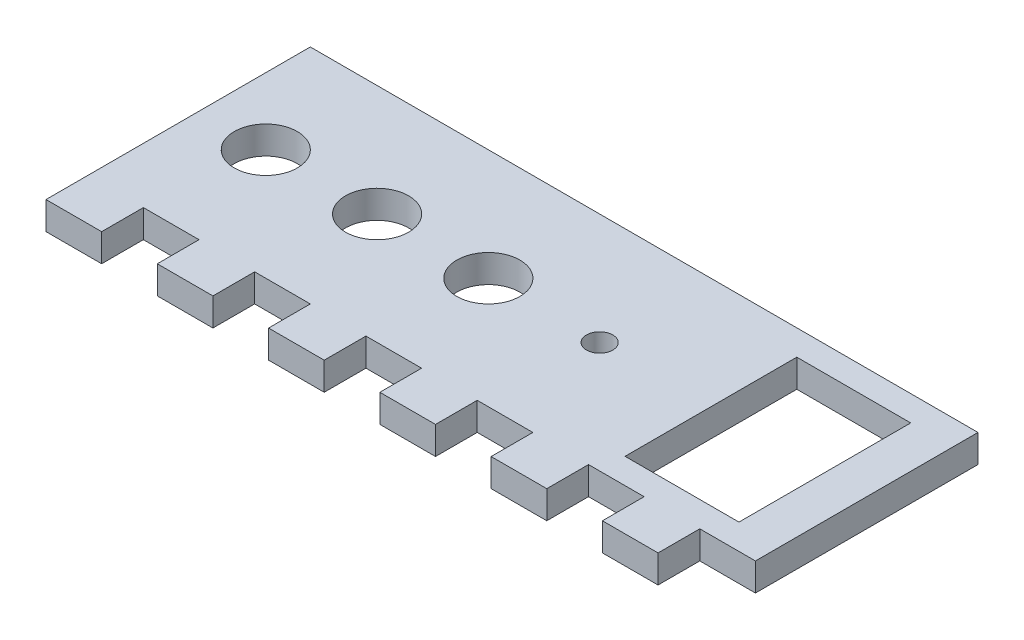
ISO-10303-21;
HEADER;
FILE_DESCRIPTION(('STEP AP214'),'2;1');
FILE_NAME('part.step','',(''),(''),'','','');
FILE_SCHEMA(('AUTOMOTIVE_DESIGN { 1 0 10303 214 1 1 1 1 }'));
ENDSEC;
DATA;
#1=APPLICATION_CONTEXT('core data for automotive mechanical design processes');
#2=APPLICATION_PROTOCOL_DEFINITION('international standard','automotive_design',2000,#1);
#3=PRODUCT_CONTEXT('',#1,'mechanical');
#4=PRODUCT('Part','Part','',(#3));
#5=PRODUCT_RELATED_PRODUCT_CATEGORY('part','',(#4));
#6=PRODUCT_DEFINITION_FORMATION('','',#4);
#7=PRODUCT_DEFINITION_CONTEXT('part definition',#1,'design');
#8=PRODUCT_DEFINITION('design','',#6,#7);
#9=PRODUCT_DEFINITION_SHAPE('','',#8);
#10=(LENGTH_UNIT() NAMED_UNIT(*) SI_UNIT(.MILLI.,.METRE.));
#11=(NAMED_UNIT(*) PLANE_ANGLE_UNIT() SI_UNIT($,.RADIAN.));
#12=(NAMED_UNIT(*) SI_UNIT($,.STERADIAN.) SOLID_ANGLE_UNIT());
#13=UNCERTAINTY_MEASURE_WITH_UNIT(LENGTH_MEASURE(1.E-05),#10,'distance_accuracy_value','');
#14=(GEOMETRIC_REPRESENTATION_CONTEXT(3) GLOBAL_UNCERTAINTY_ASSIGNED_CONTEXT((#13)) GLOBAL_UNIT_ASSIGNED_CONTEXT((#10,
#11,#12)) REPRESENTATION_CONTEXT('',''));
#15=CARTESIAN_POINT('',(0.,0.,0.));
#16=DIRECTION('',(0.,0.,1.));
#17=DIRECTION('',(1.,0.,0.));
#18=AXIS2_PLACEMENT_3D('',#15,#16,#17);
#19=CARTESIAN_POINT('',(0.,3.175,0.));
#20=DIRECTION('',(0.,-1.,0.));
#21=DIRECTION('',(0.,0.,-1.));
#22=AXIS2_PLACEMENT_3D('',#19,#20,#21);
#23=PLANE('',#22);
#24=CARTESIAN_POINT('',(7.62,3.175,-12.7));
#25=DIRECTION('',(0.,1.,0.));
#26=DIRECTION('',(0.,0.,1.));
#27=AXIS2_PLACEMENT_3D('',#24,#25,#26);
#28=CIRCLE('',#27,3.6);
#29=CARTESIAN_POINT('',(7.62,3.175,-9.1));
#30=VERTEX_POINT('',#29);
#31=EDGE_CURVE('E901',#30,#30,#28,.T.);
#32=ORIENTED_EDGE('',*,*,#31,.F.);
#33=EDGE_LOOP('',(#32));
#34=FACE_BOUND('',#33,.T.);
#35=CARTESIAN_POINT('',(45.72,3.175,-12.7));
#36=DIRECTION('',(0.,1.,0.));
#37=DIRECTION('',(0.,0.,1.));
#38=AXIS2_PLACEMENT_3D('',#35,#36,#37);
#39=CIRCLE('',#38,1.5);
#40=CARTESIAN_POINT('',(45.72,3.175,-11.2));
#41=VERTEX_POINT('',#40);
#42=EDGE_CURVE('E910',#41,#41,#39,.T.);
#43=ORIENTED_EDGE('',*,*,#42,.F.);
#44=EDGE_LOOP('',(#43));
#45=FACE_BOUND('',#44,.T.);
#46=CARTESIAN_POINT('',(33.02,3.175,-12.7));
#47=DIRECTION('',(0.,1.,0.));
#48=DIRECTION('',(0.,0.,1.));
#49=AXIS2_PLACEMENT_3D('',#46,#47,#48);
#50=CIRCLE('',#49,3.6);
#51=CARTESIAN_POINT('',(33.02,3.175,-9.1));
#52=VERTEX_POINT('',#51);
#53=EDGE_CURVE('E916',#52,#52,#50,.T.);
#54=ORIENTED_EDGE('',*,*,#53,.F.);
#55=EDGE_LOOP('',(#54));
#56=FACE_BOUND('',#55,.T.);
#57=CARTESIAN_POINT('',(20.32,3.175,-12.7));
#58=DIRECTION('',(0.,1.,0.));
#59=DIRECTION('',(0.,0.,1.));
#60=AXIS2_PLACEMENT_3D('',#57,#58,#59);
#61=CIRCLE('',#60,3.6);
#62=CARTESIAN_POINT('',(20.32,3.175,-9.1));
#63=VERTEX_POINT('',#62);
#64=EDGE_CURVE('E285',#63,#63,#61,.T.);
#65=ORIENTED_EDGE('',*,*,#64,.F.);
#66=EDGE_LOOP('',(#65));
#67=FACE_BOUND('',#66,.T.);
#68=DIRECTION('',(0.,0.,1.));
#69=VECTOR('',#68,1.);
#70=CARTESIAN_POINT('',(0.,3.175,0.));
#71=LINE('',#70,#69);
#72=CARTESIAN_POINT('',(0.,3.175,-25.4));
#73=VERTEX_POINT('',#72);
#74=CARTESIAN_POINT('',(0.,3.175,4.7625));
#75=VERTEX_POINT('',#74);
#76=EDGE_CURVE('E336',#73,#75,#71,.T.);
#77=ORIENTED_EDGE('',*,*,#76,.T.);
#78=DIRECTION('',(1.,0.,0.));
#79=VECTOR('',#78,1.);
#80=CARTESIAN_POINT('',(0.,3.175,4.7625));
#81=LINE('',#80,#79);
#82=CARTESIAN_POINT('',(6.35,3.175,4.7625));
#83=VERTEX_POINT('',#82);
#84=EDGE_CURVE('E533',#75,#83,#81,.T.);
#85=ORIENTED_EDGE('',*,*,#84,.T.);
#86=DIRECTION('',(0.,0.,-1.));
#87=VECTOR('',#86,1.);
#88=CARTESIAN_POINT('',(6.35,3.175,4.7625));
#89=LINE('',#88,#87);
#90=CARTESIAN_POINT('',(6.35,3.175,0.));
#91=VERTEX_POINT('',#90);
#92=EDGE_CURVE('E414',#83,#91,#89,.T.);
#93=ORIENTED_EDGE('',*,*,#92,.T.);
#94=DIRECTION('',(1.,0.,0.));
#95=VECTOR('',#94,1.);
#96=CARTESIAN_POINT('',(6.35,3.175,0.));
#97=LINE('',#96,#95);
#98=CARTESIAN_POINT('',(12.7,3.175,0.));
#99=VERTEX_POINT('',#98);
#100=EDGE_CURVE('E436',#91,#99,#97,.T.);
#101=ORIENTED_EDGE('',*,*,#100,.T.);
#102=DIRECTION('',(0.,0.,1.));
#103=VECTOR('',#102,1.);
#104=CARTESIAN_POINT('',(12.7,3.175,0.));
#105=LINE('',#104,#103);
#106=CARTESIAN_POINT('',(12.7,3.175,4.7625));
#107=VERTEX_POINT('',#106);
#108=EDGE_CURVE('E432',#99,#107,#105,.T.);
#109=ORIENTED_EDGE('',*,*,#108,.T.);
#110=DIRECTION('',(1.,0.,0.));
#111=VECTOR('',#110,1.);
#112=CARTESIAN_POINT('',(12.7,3.175,4.7625));
#113=LINE('',#112,#111);
#114=CARTESIAN_POINT('',(19.05,3.175,4.7625));
#115=VERTEX_POINT('',#114);
#116=EDGE_CURVE('E435',#107,#115,#113,.T.);
#117=ORIENTED_EDGE('',*,*,#116,.T.);
#118=DIRECTION('',(0.,0.,-1.));
#119=VECTOR('',#118,1.);
#120=CARTESIAN_POINT('',(19.05,3.175,4.7625));
#121=LINE('',#120,#119);
#122=CARTESIAN_POINT('',(19.05,3.175,0.));
#123=VERTEX_POINT('',#122);
#124=EDGE_CURVE('E438',#115,#123,#121,.T.);
#125=ORIENTED_EDGE('',*,*,#124,.T.);
#126=DIRECTION('',(1.,0.,0.));
#127=VECTOR('',#126,1.);
#128=CARTESIAN_POINT('',(19.05,3.175,0.));
#129=LINE('',#128,#127);
#130=CARTESIAN_POINT('',(25.4,3.175,0.));
#131=VERTEX_POINT('',#130);
#132=EDGE_CURVE('E455',#123,#131,#129,.T.);
#133=ORIENTED_EDGE('',*,*,#132,.T.);
#134=DIRECTION('',(0.,0.,1.));
#135=VECTOR('',#134,1.);
#136=CARTESIAN_POINT('',(25.4,3.175,0.));
#137=LINE('',#136,#135);
#138=CARTESIAN_POINT('',(25.4,3.175,4.7625));
#139=VERTEX_POINT('',#138);
#140=EDGE_CURVE('E458',#131,#139,#137,.T.);
#141=ORIENTED_EDGE('',*,*,#140,.T.);
#142=DIRECTION('',(1.,0.,0.));
#143=VECTOR('',#142,1.);
#144=CARTESIAN_POINT('',(25.4,3.175,4.7625));
#145=LINE('',#144,#143);
#146=CARTESIAN_POINT('',(31.75,3.175,4.7625));
#147=VERTEX_POINT('',#146);
#148=EDGE_CURVE('E461',#139,#147,#145,.T.);
#149=ORIENTED_EDGE('',*,*,#148,.T.);
#150=DIRECTION('',(0.,0.,-1.));
#151=VECTOR('',#150,1.);
#152=CARTESIAN_POINT('',(31.75,3.175,4.7625));
#153=LINE('',#152,#151);
#154=CARTESIAN_POINT('',(31.75,3.175,0.));
#155=VERTEX_POINT('',#154);
#156=EDGE_CURVE('E469',#147,#155,#153,.T.);
#157=ORIENTED_EDGE('',*,*,#156,.T.);
#158=DIRECTION('',(1.,0.,0.));
#159=VECTOR('',#158,1.);
#160=CARTESIAN_POINT('',(31.75,3.175,0.));
#161=LINE('',#160,#159);
#162=CARTESIAN_POINT('',(38.1,3.175,0.));
#163=VERTEX_POINT('',#162);
#164=EDGE_CURVE('E471',#155,#163,#161,.T.);
#165=ORIENTED_EDGE('',*,*,#164,.T.);
#166=DIRECTION('',(0.,0.,1.));
#167=VECTOR('',#166,1.);
#168=CARTESIAN_POINT('',(38.1,3.175,0.));
#169=LINE('',#168,#167);
#170=CARTESIAN_POINT('',(38.1,3.175,4.7625));
#171=VERTEX_POINT('',#170);
#172=EDGE_CURVE('E474',#163,#171,#169,.T.);
#173=ORIENTED_EDGE('',*,*,#172,.T.);
#174=DIRECTION('',(1.,0.,0.));
#175=VECTOR('',#174,1.);
#176=CARTESIAN_POINT('',(38.1,3.175,4.7625));
#177=LINE('',#176,#175);
#178=CARTESIAN_POINT('',(44.45,3.175,4.7625));
#179=VERTEX_POINT('',#178);
#180=EDGE_CURVE('E477',#171,#179,#177,.T.);
#181=ORIENTED_EDGE('',*,*,#180,.T.);
#182=DIRECTION('',(0.,0.,-1.));
#183=VECTOR('',#182,1.);
#184=CARTESIAN_POINT('',(44.45,3.175,4.7625));
#185=LINE('',#184,#183);
#186=CARTESIAN_POINT('',(44.45,3.175,0.));
#187=VERTEX_POINT('',#186);
#188=EDGE_CURVE('E485',#179,#187,#185,.T.);
#189=ORIENTED_EDGE('',*,*,#188,.T.);
#190=DIRECTION('',(1.,0.,0.));
#191=VECTOR('',#190,1.);
#192=CARTESIAN_POINT('',(44.45,3.175,0.));
#193=LINE('',#192,#191);
#194=CARTESIAN_POINT('',(50.8,3.175,0.));
#195=VERTEX_POINT('',#194);
#196=EDGE_CURVE('E487',#187,#195,#193,.T.);
#197=ORIENTED_EDGE('',*,*,#196,.T.);
#198=DIRECTION('',(0.,0.,1.));
#199=VECTOR('',#198,1.);
#200=CARTESIAN_POINT('',(50.8,3.175,0.));
#201=LINE('',#200,#199);
#202=CARTESIAN_POINT('',(50.8,3.175,4.7625));
#203=VERTEX_POINT('',#202);
#204=EDGE_CURVE('E490',#195,#203,#201,.T.);
#205=ORIENTED_EDGE('',*,*,#204,.T.);
#206=DIRECTION('',(1.,0.,0.));
#207=VECTOR('',#206,1.);
#208=CARTESIAN_POINT('',(50.8,3.175,4.7625));
#209=LINE('',#208,#207);
#210=CARTESIAN_POINT('',(57.15,3.175,4.7625));
#211=VERTEX_POINT('',#210);
#212=EDGE_CURVE('E493',#203,#211,#209,.T.);
#213=ORIENTED_EDGE('',*,*,#212,.T.);
#214=DIRECTION('',(0.,0.,-1.));
#215=VECTOR('',#214,1.);
#216=CARTESIAN_POINT('',(57.15,3.175,4.7625));
#217=LINE('',#216,#215);
#218=CARTESIAN_POINT('',(57.15,3.175,0.));
#219=VERTEX_POINT('',#218);
#220=EDGE_CURVE('E501',#211,#219,#217,.T.);
#221=ORIENTED_EDGE('',*,*,#220,.T.);
#222=DIRECTION('',(1.,0.,0.));
#223=VECTOR('',#222,1.);
#224=CARTESIAN_POINT('',(57.15,3.175,0.));
#225=LINE('',#224,#223);
#226=CARTESIAN_POINT('',(63.5,3.175,0.));
#227=VERTEX_POINT('',#226);
#228=EDGE_CURVE('E503',#219,#227,#225,.T.);
#229=ORIENTED_EDGE('',*,*,#228,.T.);
#230=DIRECTION('',(0.,0.,1.));
#231=VECTOR('',#230,1.);
#232=CARTESIAN_POINT('',(63.5,3.175,0.));
#233=LINE('',#232,#231);
#234=CARTESIAN_POINT('',(63.5,3.175,4.7625));
#235=VERTEX_POINT('',#234);
#236=EDGE_CURVE('E506',#227,#235,#233,.T.);
#237=ORIENTED_EDGE('',*,*,#236,.T.);
#238=DIRECTION('',(1.,0.,0.));
#239=VECTOR('',#238,1.);
#240=CARTESIAN_POINT('',(63.5,3.175,4.7625));
#241=LINE('',#240,#239);
#242=CARTESIAN_POINT('',(69.85,3.175,4.7625));
#243=VERTEX_POINT('',#242);
#244=EDGE_CURVE('E509',#235,#243,#241,.T.);
#245=ORIENTED_EDGE('',*,*,#244,.T.);
#246=DIRECTION('',(0.,0.,-1.));
#247=VECTOR('',#246,1.);
#248=CARTESIAN_POINT('',(69.85,3.175,4.7625));
#249=LINE('',#248,#247);
#250=CARTESIAN_POINT('',(69.85,3.175,0.));
#251=VERTEX_POINT('',#250);
#252=EDGE_CURVE('E514',#243,#251,#249,.T.);
#253=ORIENTED_EDGE('',*,*,#252,.T.);
#254=DIRECTION('',(1.,0.,0.));
#255=VECTOR('',#254,1.);
#256=CARTESIAN_POINT('',(69.85,3.175,0.));
#257=LINE('',#256,#255);
#258=CARTESIAN_POINT('',(76.2,3.175,0.));
#259=VERTEX_POINT('',#258);
#260=EDGE_CURVE('E516',#251,#259,#257,.T.);
#261=ORIENTED_EDGE('',*,*,#260,.T.);
#262=DIRECTION('',(0.,0.,-1.));
#263=VECTOR('',#262,1.);
#264=CARTESIAN_POINT('',(76.2,3.175,0.));
#265=LINE('',#264,#263);
#266=CARTESIAN_POINT('',(76.2,3.175,-25.4));
#267=VERTEX_POINT('',#266);
#268=EDGE_CURVE('E279',#259,#267,#265,.T.);
#269=ORIENTED_EDGE('',*,*,#268,.T.);
#270=DIRECTION('',(-1.,0.,0.));
#271=VECTOR('',#270,1.);
#272=CARTESIAN_POINT('',(0.,3.175,-25.4));
#273=LINE('',#272,#271);
#274=EDGE_CURVE('E275',#267,#73,#273,.T.);
#275=ORIENTED_EDGE('',*,*,#274,.T.);
#276=EDGE_LOOP('',(#77,#85,#93,#101,#109,#117,#125,#133,#141,#149,#157,#165,#173,#181,#189,#197,
#205,#213,#221,#229,#237,#245,#253,#261,#269,#275));
#277=FACE_BOUND('',#276,.T.);
#278=DIRECTION('',(0.,0.,1.));
#279=VECTOR('',#278,1.);
#280=CARTESIAN_POINT('',(58.42,3.175,-22.5));
#281=LINE('',#280,#279);
#282=CARTESIAN_POINT('',(58.42,3.175,-22.5));
#283=VERTEX_POINT('',#282);
#284=CARTESIAN_POINT('',(58.42,3.175,-2.9));
#285=VERTEX_POINT('',#284);
#286=EDGE_CURVE('E239',#283,#285,#281,.T.);
#287=ORIENTED_EDGE('',*,*,#286,.F.);
#288=DIRECTION('',(-1.,0.,0.));
#289=VECTOR('',#288,1.);
#290=CARTESIAN_POINT('',(58.42,3.175,-22.5));
#291=LINE('',#290,#289);
#292=CARTESIAN_POINT('',(71.42,3.175,-22.5));
#293=VERTEX_POINT('',#292);
#294=EDGE_CURVE('E260',#293,#283,#291,.T.);
#295=ORIENTED_EDGE('',*,*,#294,.F.);
#296=DIRECTION('',(0.,0.,-1.));
#297=VECTOR('',#296,1.);
#298=CARTESIAN_POINT('',(71.42,3.175,-22.5));
#299=LINE('',#298,#297);
#300=CARTESIAN_POINT('',(71.42,3.175,-2.9));
#301=VERTEX_POINT('',#300);
#302=EDGE_CURVE('E259',#301,#293,#299,.T.);
#303=ORIENTED_EDGE('',*,*,#302,.F.);
#304=DIRECTION('',(1.,0.,0.));
#305=VECTOR('',#304,1.);
#306=CARTESIAN_POINT('',(58.42,3.175,-2.9));
#307=LINE('',#306,#305);
#308=EDGE_CURVE('E247',#285,#301,#307,.T.);
#309=ORIENTED_EDGE('',*,*,#308,.F.);
#310=EDGE_LOOP('',(#287,#295,#303,#309));
#311=FACE_BOUND('',#310,.T.);
#312=ADVANCED_FACE('F42',(#34,#45,#56,#67,#277,#311),#23,.F.);
#313=CARTESIAN_POINT('',(0.,0.,0.));
#314=DIRECTION('',(0.,-1.,0.));
#315=DIRECTION('',(0.,0.,-1.));
#316=AXIS2_PLACEMENT_3D('',#313,#314,#315);
#317=PLANE('',#316);
#318=CARTESIAN_POINT('',(45.72,0.,-12.7));
#319=DIRECTION('',(0.,1.,0.));
#320=DIRECTION('',(0.,0.,1.));
#321=AXIS2_PLACEMENT_3D('',#318,#319,#320);
#322=CIRCLE('',#321,1.5);
#323=CARTESIAN_POINT('',(45.72,0.,-11.2));
#324=VERTEX_POINT('',#323);
#325=EDGE_CURVE('E905',#324,#324,#322,.T.);
#326=ORIENTED_EDGE('',*,*,#325,.T.);
#327=EDGE_LOOP('',(#326));
#328=FACE_BOUND('',#327,.T.);
#329=CARTESIAN_POINT('',(20.32,0.,-12.7));
#330=DIRECTION('',(0.,1.,0.));
#331=DIRECTION('',(0.,0.,1.));
#332=AXIS2_PLACEMENT_3D('',#329,#330,#331);
#333=CIRCLE('',#332,3.6);
#334=CARTESIAN_POINT('',(20.32,0.,-9.1));
#335=VERTEX_POINT('',#334);
#336=EDGE_CURVE('E538',#335,#335,#333,.T.);
#337=ORIENTED_EDGE('',*,*,#336,.T.);
#338=EDGE_LOOP('',(#337));
#339=FACE_BOUND('',#338,.T.);
#340=DIRECTION('',(0.,0.,1.));
#341=VECTOR('',#340,1.);
#342=CARTESIAN_POINT('',(0.,0.,0.));
#343=LINE('',#342,#341);
#344=CARTESIAN_POINT('',(0.,0.,-25.4));
#345=VERTEX_POINT('',#344);
#346=CARTESIAN_POINT('',(0.,0.,4.7625));
#347=VERTEX_POINT('',#346);
#348=EDGE_CURVE('E282',#345,#347,#343,.T.);
#349=ORIENTED_EDGE('',*,*,#348,.F.);
#350=DIRECTION('',(-1.,0.,0.));
#351=VECTOR('',#350,1.);
#352=CARTESIAN_POINT('',(0.,0.,-25.4));
#353=LINE('',#352,#351);
#354=CARTESIAN_POINT('',(76.2,0.,-25.4));
#355=VERTEX_POINT('',#354);
#356=EDGE_CURVE('E333',#355,#345,#353,.T.);
#357=ORIENTED_EDGE('',*,*,#356,.F.);
#358=DIRECTION('',(0.,0.,-1.));
#359=VECTOR('',#358,1.);
#360=CARTESIAN_POINT('',(76.2,0.,0.));
#361=LINE('',#360,#359);
#362=CARTESIAN_POINT('',(76.2,0.,0.));
#363=VERTEX_POINT('',#362);
#364=EDGE_CURVE('E331',#363,#355,#361,.T.);
#365=ORIENTED_EDGE('',*,*,#364,.F.);
#366=DIRECTION('',(1.,0.,0.));
#367=VECTOR('',#366,1.);
#368=CARTESIAN_POINT('',(69.85,0.,0.));
#369=LINE('',#368,#367);
#370=CARTESIAN_POINT('',(69.85,0.,0.));
#371=VERTEX_POINT('',#370);
#372=EDGE_CURVE('E329',#371,#363,#369,.T.);
#373=ORIENTED_EDGE('',*,*,#372,.F.);
#374=DIRECTION('',(0.,0.,-1.));
#375=VECTOR('',#374,1.);
#376=CARTESIAN_POINT('',(69.85,0.,4.7625));
#377=LINE('',#376,#375);
#378=CARTESIAN_POINT('',(69.85,0.,4.7625));
#379=VERTEX_POINT('',#378);
#380=EDGE_CURVE('E327',#379,#371,#377,.T.);
#381=ORIENTED_EDGE('',*,*,#380,.F.);
#382=DIRECTION('',(1.,0.,0.));
#383=VECTOR('',#382,1.);
#384=CARTESIAN_POINT('',(63.5,0.,4.7625));
#385=LINE('',#384,#383);
#386=CARTESIAN_POINT('',(63.5,0.,4.7625));
#387=VERTEX_POINT('',#386);
#388=EDGE_CURVE('E325',#387,#379,#385,.T.);
#389=ORIENTED_EDGE('',*,*,#388,.F.);
#390=DIRECTION('',(0.,0.,1.));
#391=VECTOR('',#390,1.);
#392=CARTESIAN_POINT('',(63.5,0.,0.));
#393=LINE('',#392,#391);
#394=CARTESIAN_POINT('',(63.5,0.,0.));
#395=VERTEX_POINT('',#394);
#396=EDGE_CURVE('E323',#395,#387,#393,.T.);
#397=ORIENTED_EDGE('',*,*,#396,.F.);
#398=DIRECTION('',(1.,0.,0.));
#399=VECTOR('',#398,1.);
#400=CARTESIAN_POINT('',(57.15,0.,0.));
#401=LINE('',#400,#399);
#402=CARTESIAN_POINT('',(57.15,0.,0.));
#403=VERTEX_POINT('',#402);
#404=EDGE_CURVE('E321',#403,#395,#401,.T.);
#405=ORIENTED_EDGE('',*,*,#404,.F.);
#406=DIRECTION('',(0.,0.,-1.));
#407=VECTOR('',#406,1.);
#408=CARTESIAN_POINT('',(57.15,0.,4.7625));
#409=LINE('',#408,#407);
#410=CARTESIAN_POINT('',(57.15,0.,4.7625));
#411=VERTEX_POINT('',#410);
#412=EDGE_CURVE('E319',#411,#403,#409,.T.);
#413=ORIENTED_EDGE('',*,*,#412,.F.);
#414=DIRECTION('',(1.,0.,0.));
#415=VECTOR('',#414,1.);
#416=CARTESIAN_POINT('',(50.8,0.,4.7625));
#417=LINE('',#416,#415);
#418=CARTESIAN_POINT('',(50.8,0.,4.7625));
#419=VERTEX_POINT('',#418);
#420=EDGE_CURVE('E317',#419,#411,#417,.T.);
#421=ORIENTED_EDGE('',*,*,#420,.F.);
#422=DIRECTION('',(0.,0.,1.));
#423=VECTOR('',#422,1.);
#424=CARTESIAN_POINT('',(50.8,0.,0.));
#425=LINE('',#424,#423);
#426=CARTESIAN_POINT('',(50.8,0.,0.));
#427=VERTEX_POINT('',#426);
#428=EDGE_CURVE('E315',#427,#419,#425,.T.);
#429=ORIENTED_EDGE('',*,*,#428,.F.);
#430=DIRECTION('',(1.,0.,0.));
#431=VECTOR('',#430,1.);
#432=CARTESIAN_POINT('',(44.45,0.,0.));
#433=LINE('',#432,#431);
#434=CARTESIAN_POINT('',(44.45,0.,0.));
#435=VERTEX_POINT('',#434);
#436=EDGE_CURVE('E313',#435,#427,#433,.T.);
#437=ORIENTED_EDGE('',*,*,#436,.F.);
#438=DIRECTION('',(0.,0.,-1.));
#439=VECTOR('',#438,1.);
#440=CARTESIAN_POINT('',(44.45,0.,4.7625));
#441=LINE('',#440,#439);
#442=CARTESIAN_POINT('',(44.45,0.,4.7625));
#443=VERTEX_POINT('',#442);
#444=EDGE_CURVE('E311',#443,#435,#441,.T.);
#445=ORIENTED_EDGE('',*,*,#444,.F.);
#446=DIRECTION('',(1.,0.,0.));
#447=VECTOR('',#446,1.);
#448=CARTESIAN_POINT('',(38.1,0.,4.7625));
#449=LINE('',#448,#447);
#450=CARTESIAN_POINT('',(38.1,0.,4.7625));
#451=VERTEX_POINT('',#450);
#452=EDGE_CURVE('E309',#451,#443,#449,.T.);
#453=ORIENTED_EDGE('',*,*,#452,.F.);
#454=DIRECTION('',(0.,0.,1.));
#455=VECTOR('',#454,1.);
#456=CARTESIAN_POINT('',(38.1,0.,0.));
#457=LINE('',#456,#455);
#458=CARTESIAN_POINT('',(38.1,0.,0.));
#459=VERTEX_POINT('',#458);
#460=EDGE_CURVE('E307',#459,#451,#457,.T.);
#461=ORIENTED_EDGE('',*,*,#460,.F.);
#462=DIRECTION('',(1.,0.,0.));
#463=VECTOR('',#462,1.);
#464=CARTESIAN_POINT('',(31.75,0.,0.));
#465=LINE('',#464,#463);
#466=CARTESIAN_POINT('',(31.75,0.,0.));
#467=VERTEX_POINT('',#466);
#468=EDGE_CURVE('E305',#467,#459,#465,.T.);
#469=ORIENTED_EDGE('',*,*,#468,.F.);
#470=DIRECTION('',(0.,0.,-1.));
#471=VECTOR('',#470,1.);
#472=CARTESIAN_POINT('',(31.75,0.,4.7625));
#473=LINE('',#472,#471);
#474=CARTESIAN_POINT('',(31.75,0.,4.7625));
#475=VERTEX_POINT('',#474);
#476=EDGE_CURVE('E303',#475,#467,#473,.T.);
#477=ORIENTED_EDGE('',*,*,#476,.F.);
#478=DIRECTION('',(1.,0.,0.));
#479=VECTOR('',#478,1.);
#480=CARTESIAN_POINT('',(25.4,0.,4.7625));
#481=LINE('',#480,#479);
#482=CARTESIAN_POINT('',(25.4,0.,4.7625));
#483=VERTEX_POINT('',#482);
#484=EDGE_CURVE('E301',#483,#475,#481,.T.);
#485=ORIENTED_EDGE('',*,*,#484,.F.);
#486=DIRECTION('',(0.,0.,1.));
#487=VECTOR('',#486,1.);
#488=CARTESIAN_POINT('',(25.4,0.,0.));
#489=LINE('',#488,#487);
#490=CARTESIAN_POINT('',(25.4,0.,0.));
#491=VERTEX_POINT('',#490);
#492=EDGE_CURVE('E299',#491,#483,#489,.T.);
#493=ORIENTED_EDGE('',*,*,#492,.F.);
#494=DIRECTION('',(1.,0.,0.));
#495=VECTOR('',#494,1.);
#496=CARTESIAN_POINT('',(19.05,0.,0.));
#497=LINE('',#496,#495);
#498=CARTESIAN_POINT('',(19.05,0.,0.));
#499=VERTEX_POINT('',#498);
#500=EDGE_CURVE('E297',#499,#491,#497,.T.);
#501=ORIENTED_EDGE('',*,*,#500,.F.);
#502=DIRECTION('',(0.,0.,-1.));
#503=VECTOR('',#502,1.);
#504=CARTESIAN_POINT('',(19.05,0.,4.7625));
#505=LINE('',#504,#503);
#506=CARTESIAN_POINT('',(19.05,0.,4.7625));
#507=VERTEX_POINT('',#506);
#508=EDGE_CURVE('E295',#507,#499,#505,.T.);
#509=ORIENTED_EDGE('',*,*,#508,.F.);
#510=DIRECTION('',(1.,0.,0.));
#511=VECTOR('',#510,1.);
#512=CARTESIAN_POINT('',(12.7,0.,4.7625));
#513=LINE('',#512,#511);
#514=CARTESIAN_POINT('',(12.7,0.,4.7625));
#515=VERTEX_POINT('',#514);
#516=EDGE_CURVE('E293',#515,#507,#513,.T.);
#517=ORIENTED_EDGE('',*,*,#516,.F.);
#518=DIRECTION('',(0.,0.,1.));
#519=VECTOR('',#518,1.);
#520=CARTESIAN_POINT('',(12.7,0.,0.));
#521=LINE('',#520,#519);
#522=CARTESIAN_POINT('',(12.7,0.,0.));
#523=VERTEX_POINT('',#522);
#524=EDGE_CURVE('E291',#523,#515,#521,.T.);
#525=ORIENTED_EDGE('',*,*,#524,.F.);
#526=DIRECTION('',(1.,0.,0.));
#527=VECTOR('',#526,1.);
#528=CARTESIAN_POINT('',(6.35,0.,0.));
#529=LINE('',#528,#527);
#530=CARTESIAN_POINT('',(6.35,0.,0.));
#531=VERTEX_POINT('',#530);
#532=EDGE_CURVE('E289',#531,#523,#529,.T.);
#533=ORIENTED_EDGE('',*,*,#532,.F.);
#534=DIRECTION('',(0.,0.,-1.));
#535=VECTOR('',#534,1.);
#536=CARTESIAN_POINT('',(6.35,0.,4.7625));
#537=LINE('',#536,#535);
#538=CARTESIAN_POINT('',(6.35,0.,4.7625));
#539=VERTEX_POINT('',#538);
#540=EDGE_CURVE('E287',#539,#531,#537,.T.);
#541=ORIENTED_EDGE('',*,*,#540,.F.);
#542=DIRECTION('',(1.,0.,0.));
#543=VECTOR('',#542,1.);
#544=CARTESIAN_POINT('',(0.,0.,4.7625));
#545=LINE('',#544,#543);
#546=EDGE_CURVE('E284',#347,#539,#545,.T.);
#547=ORIENTED_EDGE('',*,*,#546,.F.);
#548=EDGE_LOOP('',(#349,#357,#365,#373,#381,#389,#397,#405,#413,#421,#429,#437,#445,#453,#461,
#469,#477,#485,#493,#501,#509,#517,#525,#533,#541,#547));
#549=FACE_BOUND('',#548,.T.);
#550=CARTESIAN_POINT('',(33.02,0.,-12.7));
#551=DIRECTION('',(0.,1.,0.));
#552=DIRECTION('',(0.,0.,1.));
#553=AXIS2_PLACEMENT_3D('',#550,#551,#552);
#554=CIRCLE('',#553,3.6);
#555=CARTESIAN_POINT('',(33.02,0.,-9.1));
#556=VERTEX_POINT('',#555);
#557=EDGE_CURVE('E914',#556,#556,#554,.T.);
#558=ORIENTED_EDGE('',*,*,#557,.T.);
#559=EDGE_LOOP('',(#558));
#560=FACE_BOUND('',#559,.T.);
#561=CARTESIAN_POINT('',(7.62,0.,-12.7));
#562=DIRECTION('',(0.,1.,0.));
#563=DIRECTION('',(0.,0.,1.));
#564=AXIS2_PLACEMENT_3D('',#561,#562,#563);
#565=CIRCLE('',#564,3.6);
#566=CARTESIAN_POINT('',(7.62,0.,-9.1));
#567=VERTEX_POINT('',#566);
#568=EDGE_CURVE('E255',#567,#567,#565,.T.);
#569=ORIENTED_EDGE('',*,*,#568,.T.);
#570=EDGE_LOOP('',(#569));
#571=FACE_BOUND('',#570,.T.);
#572=DIRECTION('',(-1.,0.,0.));
#573=VECTOR('',#572,1.);
#574=CARTESIAN_POINT('',(58.42,0.,-22.5));
#575=LINE('',#574,#573);
#576=CARTESIAN_POINT('',(71.42,0.,-22.5));
#577=VERTEX_POINT('',#576);
#578=CARTESIAN_POINT('',(58.42,0.,-22.5));
#579=VERTEX_POINT('',#578);
#580=EDGE_CURVE('E248',#577,#579,#575,.T.);
#581=ORIENTED_EDGE('',*,*,#580,.T.);
#582=DIRECTION('',(0.,0.,1.));
#583=VECTOR('',#582,1.);
#584=CARTESIAN_POINT('',(58.42,0.,-22.5));
#585=LINE('',#584,#583);
#586=CARTESIAN_POINT('',(58.42,0.,-2.9));
#587=VERTEX_POINT('',#586);
#588=EDGE_CURVE('E65',#579,#587,#585,.T.);
#589=ORIENTED_EDGE('',*,*,#588,.T.);
#590=DIRECTION('',(1.,0.,0.));
#591=VECTOR('',#590,1.);
#592=CARTESIAN_POINT('',(58.42,0.,-2.9));
#593=LINE('',#592,#591);
#594=CARTESIAN_POINT('',(71.42,0.,-2.9));
#595=VERTEX_POINT('',#594);
#596=EDGE_CURVE('E254',#587,#595,#593,.T.);
#597=ORIENTED_EDGE('',*,*,#596,.T.);
#598=DIRECTION('',(0.,0.,-1.));
#599=VECTOR('',#598,1.);
#600=CARTESIAN_POINT('',(71.42,0.,-22.5));
#601=LINE('',#600,#599);
#602=EDGE_CURVE('E892',#595,#577,#601,.T.);
#603=ORIENTED_EDGE('',*,*,#602,.T.);
#604=EDGE_LOOP('',(#581,#589,#597,#603));
#605=FACE_BOUND('',#604,.T.);
#606=ADVANCED_FACE('F420',(#328,#339,#549,#560,#571,#605),#317,.T.);
#607=CARTESIAN_POINT('',(0.,3.175,0.));
#608=DIRECTION('',(1.,0.,0.));
#609=DIRECTION('',(0.,0.,-1.));
#610=AXIS2_PLACEMENT_3D('',#607,#608,#609);
#611=PLANE('',#610);
#612=ORIENTED_EDGE('',*,*,#348,.T.);
#613=DIRECTION('',(0.,-1.,0.));
#614=VECTOR('',#613,1.);
#615=CARTESIAN_POINT('',(0.,3.175,4.7625));
#616=LINE('',#615,#614);
#617=EDGE_CURVE('E12',#75,#347,#616,.T.);
#618=ORIENTED_EDGE('',*,*,#617,.F.);
#619=ORIENTED_EDGE('',*,*,#76,.F.);
#620=DIRECTION('',(0.,-1.,0.));
#621=VECTOR('',#620,1.);
#622=CARTESIAN_POINT('',(0.,3.175,-25.4));
#623=LINE('',#622,#621);
#624=EDGE_CURVE('E278',#73,#345,#623,.T.);
#625=ORIENTED_EDGE('',*,*,#624,.T.);
#626=EDGE_LOOP('',(#612,#618,#619,#625));
#627=FACE_BOUND('',#626,.T.);
#628=ADVANCED_FACE('F44',(#627),#611,.F.);
#629=CARTESIAN_POINT('',(0.,3.175,4.7625));
#630=DIRECTION('',(0.,0.,-1.));
#631=DIRECTION('',(-1.,0.,0.));
#632=AXIS2_PLACEMENT_3D('',#629,#630,#631);
#633=PLANE('',#632);
#634=ORIENTED_EDGE('',*,*,#546,.T.);
#635=DIRECTION('',(0.,-1.,0.));
#636=VECTOR('',#635,1.);
#637=CARTESIAN_POINT('',(6.35,3.175,4.7625));
#638=LINE('',#637,#636);
#639=EDGE_CURVE('E50',#83,#539,#638,.T.);
#640=ORIENTED_EDGE('',*,*,#639,.F.);
#641=ORIENTED_EDGE('',*,*,#84,.F.);
#642=ORIENTED_EDGE('',*,*,#617,.T.);
#643=EDGE_LOOP('',(#634,#640,#641,#642));
#644=FACE_BOUND('',#643,.T.);
#645=ADVANCED_FACE('F546',(#644),#633,.F.);
#646=CARTESIAN_POINT('',(6.35,3.175,4.7625));
#647=DIRECTION('',(-1.,0.,0.));
#648=DIRECTION('',(0.,0.,1.));
#649=AXIS2_PLACEMENT_3D('',#646,#647,#648);
#650=PLANE('',#649);
#651=ORIENTED_EDGE('',*,*,#540,.T.);
#652=DIRECTION('',(0.,-1.,0.));
#653=VECTOR('',#652,1.);
#654=CARTESIAN_POINT('',(6.35,3.175,0.));
#655=LINE('',#654,#653);
#656=EDGE_CURVE('E405',#91,#531,#655,.T.);
#657=ORIENTED_EDGE('',*,*,#656,.F.);
#658=ORIENTED_EDGE('',*,*,#92,.F.);
#659=ORIENTED_EDGE('',*,*,#639,.T.);
#660=EDGE_LOOP('',(#651,#657,#658,#659));
#661=FACE_BOUND('',#660,.T.);
#662=ADVANCED_FACE('F412',(#661),#650,.F.);
#663=CARTESIAN_POINT('',(6.35,3.175,0.));
#664=DIRECTION('',(0.,0.,-1.));
#665=DIRECTION('',(-1.,0.,0.));
#666=AXIS2_PLACEMENT_3D('',#663,#664,#665);
#667=PLANE('',#666);
#668=ORIENTED_EDGE('',*,*,#532,.T.);
#669=DIRECTION('',(0.,-1.,0.));
#670=VECTOR('',#669,1.);
#671=CARTESIAN_POINT('',(12.7,3.175,0.));
#672=LINE('',#671,#670);
#673=EDGE_CURVE('E402',#99,#523,#672,.T.);
#674=ORIENTED_EDGE('',*,*,#673,.F.);
#675=ORIENTED_EDGE('',*,*,#100,.F.);
#676=ORIENTED_EDGE('',*,*,#656,.T.);
#677=EDGE_LOOP('',(#668,#674,#675,#676));
#678=FACE_BOUND('',#677,.T.);
#679=ADVANCED_FACE('F426',(#678),#667,.F.);
#680=CARTESIAN_POINT('',(12.7,3.175,0.));
#681=DIRECTION('',(1.,0.,0.));
#682=DIRECTION('',(0.,0.,-1.));
#683=AXIS2_PLACEMENT_3D('',#680,#681,#682);
#684=PLANE('',#683);
#685=ORIENTED_EDGE('',*,*,#524,.T.);
#686=DIRECTION('',(0.,-1.,0.));
#687=VECTOR('',#686,1.);
#688=CARTESIAN_POINT('',(12.7,3.175,4.7625));
#689=LINE('',#688,#687);
#690=EDGE_CURVE('E399',#107,#515,#689,.T.);
#691=ORIENTED_EDGE('',*,*,#690,.F.);
#692=ORIENTED_EDGE('',*,*,#108,.F.);
#693=ORIENTED_EDGE('',*,*,#673,.T.);
#694=EDGE_LOOP('',(#685,#691,#692,#693));
#695=FACE_BOUND('',#694,.T.);
#696=ADVANCED_FACE('F430',(#695),#684,.F.);
#697=CARTESIAN_POINT('',(12.7,3.175,4.7625));
#698=DIRECTION('',(0.,0.,-1.));
#699=DIRECTION('',(-1.,0.,0.));
#700=AXIS2_PLACEMENT_3D('',#697,#698,#699);
#701=PLANE('',#700);
#702=ORIENTED_EDGE('',*,*,#516,.T.);
#703=DIRECTION('',(0.,-1.,0.));
#704=VECTOR('',#703,1.);
#705=CARTESIAN_POINT('',(19.05,3.175,4.7625));
#706=LINE('',#705,#704);
#707=EDGE_CURVE('E396',#115,#507,#706,.T.);
#708=ORIENTED_EDGE('',*,*,#707,.F.);
#709=ORIENTED_EDGE('',*,*,#116,.F.);
#710=ORIENTED_EDGE('',*,*,#690,.T.);
#711=EDGE_LOOP('',(#702,#708,#709,#710));
#712=FACE_BOUND('',#711,.T.);
#713=ADVANCED_FACE('F642',(#712),#701,.F.);
#714=CARTESIAN_POINT('',(19.05,3.175,4.7625));
#715=DIRECTION('',(-1.,0.,0.));
#716=DIRECTION('',(0.,0.,1.));
#717=AXIS2_PLACEMENT_3D('',#714,#715,#716);
#718=PLANE('',#717);
#719=ORIENTED_EDGE('',*,*,#508,.T.);
#720=DIRECTION('',(0.,-1.,0.));
#721=VECTOR('',#720,1.);
#722=CARTESIAN_POINT('',(19.05,3.175,0.));
#723=LINE('',#722,#721);
#724=EDGE_CURVE('E393',#123,#499,#723,.T.);
#725=ORIENTED_EDGE('',*,*,#724,.F.);
#726=ORIENTED_EDGE('',*,*,#124,.F.);
#727=ORIENTED_EDGE('',*,*,#707,.T.);
#728=EDGE_LOOP('',(#719,#725,#726,#727));
#729=FACE_BOUND('',#728,.T.);
#730=ADVANCED_FACE('F638',(#729),#718,.F.);
#731=CARTESIAN_POINT('',(19.05,3.175,0.));
#732=DIRECTION('',(0.,0.,-1.));
#733=DIRECTION('',(-1.,0.,0.));
#734=AXIS2_PLACEMENT_3D('',#731,#732,#733);
#735=PLANE('',#734);
#736=ORIENTED_EDGE('',*,*,#500,.T.);
#737=DIRECTION('',(0.,-1.,0.));
#738=VECTOR('',#737,1.);
#739=CARTESIAN_POINT('',(25.4,3.175,0.));
#740=LINE('',#739,#738);
#741=EDGE_CURVE('E390',#131,#491,#740,.T.);
#742=ORIENTED_EDGE('',*,*,#741,.F.);
#743=ORIENTED_EDGE('',*,*,#132,.F.);
#744=ORIENTED_EDGE('',*,*,#724,.T.);
#745=EDGE_LOOP('',(#736,#742,#743,#744));
#746=FACE_BOUND('',#745,.T.);
#747=ADVANCED_FACE('F634',(#746),#735,.F.);
#748=CARTESIAN_POINT('',(25.4,3.175,0.));
#749=DIRECTION('',(1.,0.,0.));
#750=DIRECTION('',(0.,0.,-1.));
#751=AXIS2_PLACEMENT_3D('',#748,#749,#750);
#752=PLANE('',#751);
#753=ORIENTED_EDGE('',*,*,#492,.T.);
#754=DIRECTION('',(0.,-1.,0.));
#755=VECTOR('',#754,1.);
#756=CARTESIAN_POINT('',(25.4,3.175,4.7625));
#757=LINE('',#756,#755);
#758=EDGE_CURVE('E387',#139,#483,#757,.T.);
#759=ORIENTED_EDGE('',*,*,#758,.F.);
#760=ORIENTED_EDGE('',*,*,#140,.F.);
#761=ORIENTED_EDGE('',*,*,#741,.T.);
#762=EDGE_LOOP('',(#753,#759,#760,#761));
#763=FACE_BOUND('',#762,.T.);
#764=ADVANCED_FACE('F630',(#763),#752,.F.);
#765=CARTESIAN_POINT('',(25.4,3.175,4.7625));
#766=DIRECTION('',(0.,0.,-1.));
#767=DIRECTION('',(-1.,0.,0.));
#768=AXIS2_PLACEMENT_3D('',#765,#766,#767);
#769=PLANE('',#768);
#770=ORIENTED_EDGE('',*,*,#484,.T.);
#771=DIRECTION('',(0.,-1.,0.));
#772=VECTOR('',#771,1.);
#773=CARTESIAN_POINT('',(31.75,3.175,4.7625));
#774=LINE('',#773,#772);
#775=EDGE_CURVE('E384',#147,#475,#774,.T.);
#776=ORIENTED_EDGE('',*,*,#775,.F.);
#777=ORIENTED_EDGE('',*,*,#148,.F.);
#778=ORIENTED_EDGE('',*,*,#758,.T.);
#779=EDGE_LOOP('',(#770,#776,#777,#778));
#780=FACE_BOUND('',#779,.T.);
#781=ADVANCED_FACE('F626',(#780),#769,.F.);
#782=CARTESIAN_POINT('',(31.75,3.175,4.7625));
#783=DIRECTION('',(-1.,0.,0.));
#784=DIRECTION('',(0.,0.,1.));
#785=AXIS2_PLACEMENT_3D('',#782,#783,#784);
#786=PLANE('',#785);
#787=ORIENTED_EDGE('',*,*,#476,.T.);
#788=DIRECTION('',(0.,-1.,0.));
#789=VECTOR('',#788,1.);
#790=CARTESIAN_POINT('',(31.75,3.175,0.));
#791=LINE('',#790,#789);
#792=EDGE_CURVE('E381',#155,#467,#791,.T.);
#793=ORIENTED_EDGE('',*,*,#792,.F.);
#794=ORIENTED_EDGE('',*,*,#156,.F.);
#795=ORIENTED_EDGE('',*,*,#775,.T.);
#796=EDGE_LOOP('',(#787,#793,#794,#795));
#797=FACE_BOUND('',#796,.T.);
#798=ADVANCED_FACE('F622',(#797),#786,.F.);
#799=CARTESIAN_POINT('',(31.75,3.175,0.));
#800=DIRECTION('',(0.,0.,-1.));
#801=DIRECTION('',(-1.,0.,0.));
#802=AXIS2_PLACEMENT_3D('',#799,#800,#801);
#803=PLANE('',#802);
#804=ORIENTED_EDGE('',*,*,#468,.T.);
#805=DIRECTION('',(0.,-1.,0.));
#806=VECTOR('',#805,1.);
#807=CARTESIAN_POINT('',(38.1,3.175,0.));
#808=LINE('',#807,#806);
#809=EDGE_CURVE('E378',#163,#459,#808,.T.);
#810=ORIENTED_EDGE('',*,*,#809,.F.);
#811=ORIENTED_EDGE('',*,*,#164,.F.);
#812=ORIENTED_EDGE('',*,*,#792,.T.);
#813=EDGE_LOOP('',(#804,#810,#811,#812));
#814=FACE_BOUND('',#813,.T.);
#815=ADVANCED_FACE('F618',(#814),#803,.F.);
#816=CARTESIAN_POINT('',(38.1,3.175,0.));
#817=DIRECTION('',(1.,0.,0.));
#818=DIRECTION('',(0.,0.,-1.));
#819=AXIS2_PLACEMENT_3D('',#816,#817,#818);
#820=PLANE('',#819);
#821=ORIENTED_EDGE('',*,*,#460,.T.);
#822=DIRECTION('',(0.,-1.,0.));
#823=VECTOR('',#822,1.);
#824=CARTESIAN_POINT('',(38.1,3.175,4.7625));
#825=LINE('',#824,#823);
#826=EDGE_CURVE('E375',#171,#451,#825,.T.);
#827=ORIENTED_EDGE('',*,*,#826,.F.);
#828=ORIENTED_EDGE('',*,*,#172,.F.);
#829=ORIENTED_EDGE('',*,*,#809,.T.);
#830=EDGE_LOOP('',(#821,#827,#828,#829));
#831=FACE_BOUND('',#830,.T.);
#832=ADVANCED_FACE('F614',(#831),#820,.F.);
#833=CARTESIAN_POINT('',(38.1,3.175,4.7625));
#834=DIRECTION('',(0.,0.,-1.));
#835=DIRECTION('',(-1.,0.,0.));
#836=AXIS2_PLACEMENT_3D('',#833,#834,#835);
#837=PLANE('',#836);
#838=ORIENTED_EDGE('',*,*,#452,.T.);
#839=DIRECTION('',(0.,-1.,0.));
#840=VECTOR('',#839,1.);
#841=CARTESIAN_POINT('',(44.45,3.175,4.7625));
#842=LINE('',#841,#840);
#843=EDGE_CURVE('E372',#179,#443,#842,.T.);
#844=ORIENTED_EDGE('',*,*,#843,.F.);
#845=ORIENTED_EDGE('',*,*,#180,.F.);
#846=ORIENTED_EDGE('',*,*,#826,.T.);
#847=EDGE_LOOP('',(#838,#844,#845,#846));
#848=FACE_BOUND('',#847,.T.);
#849=ADVANCED_FACE('F610',(#848),#837,.F.);
#850=CARTESIAN_POINT('',(44.45,3.175,4.7625));
#851=DIRECTION('',(-1.,0.,0.));
#852=DIRECTION('',(0.,0.,1.));
#853=AXIS2_PLACEMENT_3D('',#850,#851,#852);
#854=PLANE('',#853);
#855=ORIENTED_EDGE('',*,*,#444,.T.);
#856=DIRECTION('',(0.,-1.,0.));
#857=VECTOR('',#856,1.);
#858=CARTESIAN_POINT('',(44.45,3.175,0.));
#859=LINE('',#858,#857);
#860=EDGE_CURVE('E369',#187,#435,#859,.T.);
#861=ORIENTED_EDGE('',*,*,#860,.F.);
#862=ORIENTED_EDGE('',*,*,#188,.F.);
#863=ORIENTED_EDGE('',*,*,#843,.T.);
#864=EDGE_LOOP('',(#855,#861,#862,#863));
#865=FACE_BOUND('',#864,.T.);
#866=ADVANCED_FACE('F606',(#865),#854,.F.);
#867=CARTESIAN_POINT('',(44.45,3.175,0.));
#868=DIRECTION('',(0.,0.,-1.));
#869=DIRECTION('',(-1.,0.,0.));
#870=AXIS2_PLACEMENT_3D('',#867,#868,#869);
#871=PLANE('',#870);
#872=ORIENTED_EDGE('',*,*,#436,.T.);
#873=DIRECTION('',(0.,-1.,0.));
#874=VECTOR('',#873,1.);
#875=CARTESIAN_POINT('',(50.8,3.175,0.));
#876=LINE('',#875,#874);
#877=EDGE_CURVE('E366',#195,#427,#876,.T.);
#878=ORIENTED_EDGE('',*,*,#877,.F.);
#879=ORIENTED_EDGE('',*,*,#196,.F.);
#880=ORIENTED_EDGE('',*,*,#860,.T.);
#881=EDGE_LOOP('',(#872,#878,#879,#880));
#882=FACE_BOUND('',#881,.T.);
#883=ADVANCED_FACE('F602',(#882),#871,.F.);
#884=CARTESIAN_POINT('',(50.8,3.175,0.));
#885=DIRECTION('',(1.,0.,0.));
#886=DIRECTION('',(0.,0.,-1.));
#887=AXIS2_PLACEMENT_3D('',#884,#885,#886);
#888=PLANE('',#887);
#889=ORIENTED_EDGE('',*,*,#428,.T.);
#890=DIRECTION('',(0.,-1.,0.));
#891=VECTOR('',#890,1.);
#892=CARTESIAN_POINT('',(50.8,3.175,4.7625));
#893=LINE('',#892,#891);
#894=EDGE_CURVE('E363',#203,#419,#893,.T.);
#895=ORIENTED_EDGE('',*,*,#894,.F.);
#896=ORIENTED_EDGE('',*,*,#204,.F.);
#897=ORIENTED_EDGE('',*,*,#877,.T.);
#898=EDGE_LOOP('',(#889,#895,#896,#897));
#899=FACE_BOUND('',#898,.T.);
#900=ADVANCED_FACE('F598',(#899),#888,.F.);
#901=CARTESIAN_POINT('',(50.8,3.175,4.7625));
#902=DIRECTION('',(0.,0.,-1.));
#903=DIRECTION('',(-1.,0.,0.));
#904=AXIS2_PLACEMENT_3D('',#901,#902,#903);
#905=PLANE('',#904);
#906=ORIENTED_EDGE('',*,*,#420,.T.);
#907=DIRECTION('',(0.,-1.,0.));
#908=VECTOR('',#907,1.);
#909=CARTESIAN_POINT('',(57.15,3.175,4.7625));
#910=LINE('',#909,#908);
#911=EDGE_CURVE('E360',#211,#411,#910,.T.);
#912=ORIENTED_EDGE('',*,*,#911,.F.);
#913=ORIENTED_EDGE('',*,*,#212,.F.);
#914=ORIENTED_EDGE('',*,*,#894,.T.);
#915=EDGE_LOOP('',(#906,#912,#913,#914));
#916=FACE_BOUND('',#915,.T.);
#917=ADVANCED_FACE('F594',(#916),#905,.F.);
#918=CARTESIAN_POINT('',(57.15,3.175,4.7625));
#919=DIRECTION('',(-1.,0.,0.));
#920=DIRECTION('',(0.,0.,1.));
#921=AXIS2_PLACEMENT_3D('',#918,#919,#920);
#922=PLANE('',#921);
#923=ORIENTED_EDGE('',*,*,#412,.T.);
#924=DIRECTION('',(0.,-1.,0.));
#925=VECTOR('',#924,1.);
#926=CARTESIAN_POINT('',(57.15,3.175,0.));
#927=LINE('',#926,#925);
#928=EDGE_CURVE('E357',#219,#403,#927,.T.);
#929=ORIENTED_EDGE('',*,*,#928,.F.);
#930=ORIENTED_EDGE('',*,*,#220,.F.);
#931=ORIENTED_EDGE('',*,*,#911,.T.);
#932=EDGE_LOOP('',(#923,#929,#930,#931));
#933=FACE_BOUND('',#932,.T.);
#934=ADVANCED_FACE('F590',(#933),#922,.F.);
#935=CARTESIAN_POINT('',(57.15,3.175,0.));
#936=DIRECTION('',(0.,0.,-1.));
#937=DIRECTION('',(-1.,0.,0.));
#938=AXIS2_PLACEMENT_3D('',#935,#936,#937);
#939=PLANE('',#938);
#940=ORIENTED_EDGE('',*,*,#404,.T.);
#941=DIRECTION('',(0.,-1.,0.));
#942=VECTOR('',#941,1.);
#943=CARTESIAN_POINT('',(63.5,3.175,0.));
#944=LINE('',#943,#942);
#945=EDGE_CURVE('E354',#227,#395,#944,.T.);
#946=ORIENTED_EDGE('',*,*,#945,.F.);
#947=ORIENTED_EDGE('',*,*,#228,.F.);
#948=ORIENTED_EDGE('',*,*,#928,.T.);
#949=EDGE_LOOP('',(#940,#946,#947,#948));
#950=FACE_BOUND('',#949,.T.);
#951=ADVANCED_FACE('F586',(#950),#939,.F.);
#952=CARTESIAN_POINT('',(63.5,3.175,0.));
#953=DIRECTION('',(1.,0.,0.));
#954=DIRECTION('',(0.,0.,-1.));
#955=AXIS2_PLACEMENT_3D('',#952,#953,#954);
#956=PLANE('',#955);
#957=ORIENTED_EDGE('',*,*,#396,.T.);
#958=DIRECTION('',(0.,-1.,0.));
#959=VECTOR('',#958,1.);
#960=CARTESIAN_POINT('',(63.5,3.175,4.7625));
#961=LINE('',#960,#959);
#962=EDGE_CURVE('E351',#235,#387,#961,.T.);
#963=ORIENTED_EDGE('',*,*,#962,.F.);
#964=ORIENTED_EDGE('',*,*,#236,.F.);
#965=ORIENTED_EDGE('',*,*,#945,.T.);
#966=EDGE_LOOP('',(#957,#963,#964,#965));
#967=FACE_BOUND('',#966,.T.);
#968=ADVANCED_FACE('F582',(#967),#956,.F.);
#969=CARTESIAN_POINT('',(63.5,3.175,4.7625));
#970=DIRECTION('',(0.,0.,-1.));
#971=DIRECTION('',(-1.,0.,0.));
#972=AXIS2_PLACEMENT_3D('',#969,#970,#971);
#973=PLANE('',#972);
#974=ORIENTED_EDGE('',*,*,#388,.T.);
#975=DIRECTION('',(0.,-1.,0.));
#976=VECTOR('',#975,1.);
#977=CARTESIAN_POINT('',(69.85,3.175,4.7625));
#978=LINE('',#977,#976);
#979=EDGE_CURVE('E348',#243,#379,#978,.T.);
#980=ORIENTED_EDGE('',*,*,#979,.F.);
#981=ORIENTED_EDGE('',*,*,#244,.F.);
#982=ORIENTED_EDGE('',*,*,#962,.T.);
#983=EDGE_LOOP('',(#974,#980,#981,#982));
#984=FACE_BOUND('',#983,.T.);
#985=ADVANCED_FACE('F578',(#984),#973,.F.);
#986=CARTESIAN_POINT('',(69.85,3.175,4.7625));
#987=DIRECTION('',(-1.,0.,0.));
#988=DIRECTION('',(0.,0.,1.));
#989=AXIS2_PLACEMENT_3D('',#986,#987,#988);
#990=PLANE('',#989);
#991=ORIENTED_EDGE('',*,*,#380,.T.);
#992=DIRECTION('',(0.,-1.,0.));
#993=VECTOR('',#992,1.);
#994=CARTESIAN_POINT('',(69.85,3.175,0.));
#995=LINE('',#994,#993);
#996=EDGE_CURVE('E345',#251,#371,#995,.T.);
#997=ORIENTED_EDGE('',*,*,#996,.F.);
#998=ORIENTED_EDGE('',*,*,#252,.F.);
#999=ORIENTED_EDGE('',*,*,#979,.T.);
#1000=EDGE_LOOP('',(#991,#997,#998,#999));
#1001=FACE_BOUND('',#1000,.T.);
#1002=ADVANCED_FACE('F574',(#1001),#990,.F.);
#1003=CARTESIAN_POINT('',(69.85,3.175,0.));
#1004=DIRECTION('',(0.,0.,-1.));
#1005=DIRECTION('',(-1.,0.,0.));
#1006=AXIS2_PLACEMENT_3D('',#1003,#1004,#1005);
#1007=PLANE('',#1006);
#1008=ORIENTED_EDGE('',*,*,#372,.T.);
#1009=DIRECTION('',(0.,-1.,0.));
#1010=VECTOR('',#1009,1.);
#1011=CARTESIAN_POINT('',(76.2,3.175,0.));
#1012=LINE('',#1011,#1010);
#1013=EDGE_CURVE('E342',#259,#363,#1012,.T.);
#1014=ORIENTED_EDGE('',*,*,#1013,.F.);
#1015=ORIENTED_EDGE('',*,*,#260,.F.);
#1016=ORIENTED_EDGE('',*,*,#996,.T.);
#1017=EDGE_LOOP('',(#1008,#1014,#1015,#1016));
#1018=FACE_BOUND('',#1017,.T.);
#1019=ADVANCED_FACE('F571',(#1018),#1007,.F.);
#1020=CARTESIAN_POINT('',(76.2,3.175,0.));
#1021=DIRECTION('',(-1.,0.,0.));
#1022=DIRECTION('',(0.,0.,1.));
#1023=AXIS2_PLACEMENT_3D('',#1020,#1021,#1022);
#1024=PLANE('',#1023);
#1025=ORIENTED_EDGE('',*,*,#364,.T.);
#1026=DIRECTION('',(0.,-1.,0.));
#1027=VECTOR('',#1026,1.);
#1028=CARTESIAN_POINT('',(76.2,3.175,-25.4));
#1029=LINE('',#1028,#1027);
#1030=EDGE_CURVE('E339',#267,#355,#1029,.T.);
#1031=ORIENTED_EDGE('',*,*,#1030,.F.);
#1032=ORIENTED_EDGE('',*,*,#268,.F.);
#1033=ORIENTED_EDGE('',*,*,#1013,.T.);
#1034=EDGE_LOOP('',(#1025,#1031,#1032,#1033));
#1035=FACE_BOUND('',#1034,.T.);
#1036=ADVANCED_FACE('F525',(#1035),#1024,.F.);
#1037=CARTESIAN_POINT('',(0.,3.175,-25.4));
#1038=DIRECTION('',(0.,0.,1.));
#1039=DIRECTION('',(1.,0.,0.));
#1040=AXIS2_PLACEMENT_3D('',#1037,#1038,#1039);
#1041=PLANE('',#1040);
#1042=ORIENTED_EDGE('',*,*,#356,.T.);
#1043=ORIENTED_EDGE('',*,*,#624,.F.);
#1044=ORIENTED_EDGE('',*,*,#274,.F.);
#1045=ORIENTED_EDGE('',*,*,#1030,.T.);
#1046=EDGE_LOOP('',(#1042,#1043,#1044,#1045));
#1047=FACE_BOUND('',#1046,.T.);
#1048=ADVANCED_FACE('F529',(#1047),#1041,.F.);
#1049=CARTESIAN_POINT('',(20.32,3.175,-12.7));
#1050=DIRECTION('',(0.,-1.,0.));
#1051=DIRECTION('',(0.,0.,-1.));
#1052=AXIS2_PLACEMENT_3D('',#1049,#1050,#1051);
#1053=CYLINDRICAL_SURFACE('',#1052,3.6);
#1054=ORIENTED_EDGE('',*,*,#64,.T.);
#1055=EDGE_LOOP('',(#1054));
#1056=FACE_BOUND('',#1055,.T.);
#1057=ORIENTED_EDGE('',*,*,#336,.F.);
#1058=EDGE_LOOP('',(#1057));
#1059=FACE_BOUND('',#1058,.T.);
#1060=ADVANCED_FACE('F564',(#1056,#1059),#1053,.F.);
#1061=CARTESIAN_POINT('',(33.02,3.175,-12.7));
#1062=DIRECTION('',(0.,-1.,0.));
#1063=DIRECTION('',(0.,0.,-1.));
#1064=AXIS2_PLACEMENT_3D('',#1061,#1062,#1063);
#1065=CYLINDRICAL_SURFACE('',#1064,3.6);
#1066=ORIENTED_EDGE('',*,*,#53,.T.);
#1067=EDGE_LOOP('',(#1066));
#1068=FACE_BOUND('',#1067,.T.);
#1069=ORIENTED_EDGE('',*,*,#557,.F.);
#1070=EDGE_LOOP('',(#1069));
#1071=FACE_BOUND('',#1070,.T.);
#1072=ADVANCED_FACE('F771',(#1068,#1071),#1065,.F.);
#1073=CARTESIAN_POINT('',(45.72,3.175,-12.7));
#1074=DIRECTION('',(0.,-1.,0.));
#1075=DIRECTION('',(0.,0.,-1.));
#1076=AXIS2_PLACEMENT_3D('',#1073,#1074,#1075);
#1077=CYLINDRICAL_SURFACE('',#1076,1.5);
#1078=ORIENTED_EDGE('',*,*,#42,.T.);
#1079=EDGE_LOOP('',(#1078));
#1080=FACE_BOUND('',#1079,.T.);
#1081=ORIENTED_EDGE('',*,*,#325,.F.);
#1082=EDGE_LOOP('',(#1081));
#1083=FACE_BOUND('',#1082,.T.);
#1084=ADVANCED_FACE('F779',(#1080,#1083),#1077,.F.);
#1085=CARTESIAN_POINT('',(7.62,3.175,-12.7));
#1086=DIRECTION('',(0.,-1.,0.));
#1087=DIRECTION('',(0.,0.,-1.));
#1088=AXIS2_PLACEMENT_3D('',#1085,#1086,#1087);
#1089=CYLINDRICAL_SURFACE('',#1088,3.6);
#1090=ORIENTED_EDGE('',*,*,#31,.T.);
#1091=EDGE_LOOP('',(#1090));
#1092=FACE_BOUND('',#1091,.T.);
#1093=ORIENTED_EDGE('',*,*,#568,.F.);
#1094=EDGE_LOOP('',(#1093));
#1095=FACE_BOUND('',#1094,.T.);
#1096=ADVANCED_FACE('F787',(#1092,#1095),#1089,.F.);
#1097=CARTESIAN_POINT('',(58.42,3.175,-22.5));
#1098=DIRECTION('',(1.,0.,0.));
#1099=DIRECTION('',(0.,0.,-1.));
#1100=AXIS2_PLACEMENT_3D('',#1097,#1098,#1099);
#1101=PLANE('',#1100);
#1102=ORIENTED_EDGE('',*,*,#588,.F.);
#1103=DIRECTION('',(0.,-1.,0.));
#1104=VECTOR('',#1103,1.);
#1105=CARTESIAN_POINT('',(58.42,3.175,-22.5));
#1106=LINE('',#1105,#1104);
#1107=EDGE_CURVE('E243',#283,#579,#1106,.T.);
#1108=ORIENTED_EDGE('',*,*,#1107,.F.);
#1109=ORIENTED_EDGE('',*,*,#286,.T.);
#1110=DIRECTION('',(0.,-1.,0.));
#1111=VECTOR('',#1110,1.);
#1112=CARTESIAN_POINT('',(58.42,3.175,-2.9));
#1113=LINE('',#1112,#1111);
#1114=EDGE_CURVE('E242',#285,#587,#1113,.T.);
#1115=ORIENTED_EDGE('',*,*,#1114,.T.);
#1116=EDGE_LOOP('',(#1102,#1108,#1109,#1115));
#1117=FACE_BOUND('',#1116,.T.);
#1118=ADVANCED_FACE('F241',(#1117),#1101,.T.);
#1119=CARTESIAN_POINT('',(58.42,3.175,-2.9));
#1120=DIRECTION('',(0.,0.,-1.));
#1121=DIRECTION('',(-1.,0.,0.));
#1122=AXIS2_PLACEMENT_3D('',#1119,#1120,#1121);
#1123=PLANE('',#1122);
#1124=ORIENTED_EDGE('',*,*,#596,.F.);
#1125=ORIENTED_EDGE('',*,*,#1114,.F.);
#1126=ORIENTED_EDGE('',*,*,#308,.T.);
#1127=DIRECTION('',(0.,-1.,0.));
#1128=VECTOR('',#1127,1.);
#1129=CARTESIAN_POINT('',(71.42,3.175,-2.9));
#1130=LINE('',#1129,#1128);
#1131=EDGE_CURVE('E256',#301,#595,#1130,.T.);
#1132=ORIENTED_EDGE('',*,*,#1131,.T.);
#1133=EDGE_LOOP('',(#1124,#1125,#1126,#1132));
#1134=FACE_BOUND('',#1133,.T.);
#1135=ADVANCED_FACE('F251',(#1134),#1123,.T.);
#1136=CARTESIAN_POINT('',(71.42,3.175,-22.5));
#1137=DIRECTION('',(-1.,0.,0.));
#1138=DIRECTION('',(0.,0.,1.));
#1139=AXIS2_PLACEMENT_3D('',#1136,#1137,#1138);
#1140=PLANE('',#1139);
#1141=ORIENTED_EDGE('',*,*,#602,.F.);
#1142=ORIENTED_EDGE('',*,*,#1131,.F.);
#1143=ORIENTED_EDGE('',*,*,#302,.T.);
#1144=DIRECTION('',(0.,-1.,0.));
#1145=VECTOR('',#1144,1.);
#1146=CARTESIAN_POINT('',(71.42,3.175,-22.5));
#1147=LINE('',#1146,#1145);
#1148=EDGE_CURVE('E57',#293,#577,#1147,.T.);
#1149=ORIENTED_EDGE('',*,*,#1148,.T.);
#1150=EDGE_LOOP('',(#1141,#1142,#1143,#1149));
#1151=FACE_BOUND('',#1150,.T.);
#1152=ADVANCED_FACE('F811',(#1151),#1140,.T.);
#1153=CARTESIAN_POINT('',(58.42,3.175,-22.5));
#1154=DIRECTION('',(0.,0.,1.));
#1155=DIRECTION('',(1.,0.,0.));
#1156=AXIS2_PLACEMENT_3D('',#1153,#1154,#1155);
#1157=PLANE('',#1156);
#1158=ORIENTED_EDGE('',*,*,#580,.F.);
#1159=ORIENTED_EDGE('',*,*,#1148,.F.);
#1160=ORIENTED_EDGE('',*,*,#294,.T.);
#1161=ORIENTED_EDGE('',*,*,#1107,.T.);
#1162=EDGE_LOOP('',(#1158,#1159,#1160,#1161));
#1163=FACE_BOUND('',#1162,.T.);
#1164=ADVANCED_FACE('F819',(#1163),#1157,.T.);
#1165=CLOSED_SHELL('',(#312,#606,#628,#645,#662,#679,#696,#713,#730,#747,#764,#781,#798,#815,
#832,#849,#866,#883,#900,#917,#934,#951,#968,#985,#1002,#1019,#1036,#1048,#1060,#1072,#1084,
#1096,#1118,#1135,#1152,#1164));
#1166=MANIFOLD_SOLID_BREP('B2',#1165);
#1167=ADVANCED_BREP_SHAPE_REPRESENTATION('',(#18,#1166),#14);
#1168=SHAPE_DEFINITION_REPRESENTATION(#9,#1167);
ENDSEC;
END-ISO-10303-21;
